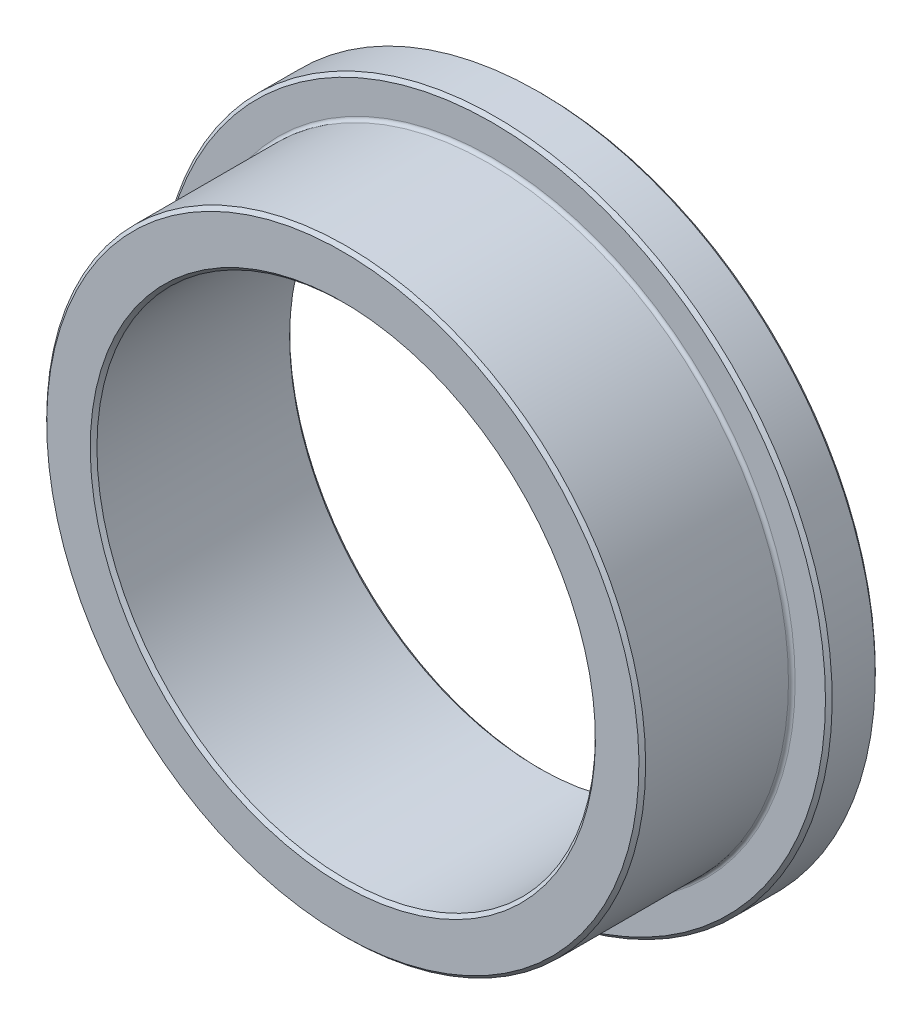
ISO-10303-21;
HEADER;
FILE_DESCRIPTION(('STEP AP214'),'2;1');
FILE_NAME('part.step','',(''),(''),'','','');
FILE_SCHEMA(('AUTOMOTIVE_DESIGN { 1 0 10303 214 1 1 1 1 }'));
ENDSEC;
DATA;
#1=APPLICATION_CONTEXT('core data for automotive mechanical design processes');
#2=APPLICATION_PROTOCOL_DEFINITION('international standard','automotive_design',2000,#1);
#3=PRODUCT_CONTEXT('',#1,'mechanical');
#4=PRODUCT('Part','Part','',(#3));
#5=PRODUCT_RELATED_PRODUCT_CATEGORY('part','',(#4));
#6=PRODUCT_DEFINITION_FORMATION('','',#4);
#7=PRODUCT_DEFINITION_CONTEXT('part definition',#1,'design');
#8=PRODUCT_DEFINITION('design','',#6,#7);
#9=PRODUCT_DEFINITION_SHAPE('','',#8);
#10=(LENGTH_UNIT() NAMED_UNIT(*) SI_UNIT(.MILLI.,.METRE.));
#11=(NAMED_UNIT(*) PLANE_ANGLE_UNIT() SI_UNIT($,.RADIAN.));
#12=(NAMED_UNIT(*) SI_UNIT($,.STERADIAN.) SOLID_ANGLE_UNIT());
#13=UNCERTAINTY_MEASURE_WITH_UNIT(LENGTH_MEASURE(1.E-05),#10,'distance_accuracy_value','');
#14=(GEOMETRIC_REPRESENTATION_CONTEXT(3) GLOBAL_UNCERTAINTY_ASSIGNED_CONTEXT((#13)) GLOBAL_UNIT_ASSIGNED_CONTEXT((#10,
#11,#12)) REPRESENTATION_CONTEXT('',''));
#15=CARTESIAN_POINT('',(0.,0.,0.));
#16=DIRECTION('',(0.,0.,1.));
#17=DIRECTION('',(1.,0.,0.));
#18=AXIS2_PLACEMENT_3D('',#15,#16,#17);
#19=CARTESIAN_POINT('',(0.,-19.0754,-3.175));
#20=DIRECTION('',(0.,0.,1.));
#21=DIRECTION('',(0.,-1.,0.));
#22=AXIS2_PLACEMENT_3D('',#19,#20,#21);
#23=PLANE('',#22);
#24=CARTESIAN_POINT('',(0.,0.,-3.175));
#25=DIRECTION('',(0.,0.,1.));
#26=DIRECTION('',(0.,-1.,0.));
#27=AXIS2_PLACEMENT_3D('',#24,#25,#26);
#28=CIRCLE('',#27,19.28876);
#29=CARTESIAN_POINT('',(0.,-19.28876,-3.175));
#30=VERTEX_POINT('',#29);
#31=EDGE_CURVE('E12',#30,#30,#28,.F.);
#32=ORIENTED_EDGE('',*,*,#31,.T.);
#33=EDGE_LOOP('',(#32));
#34=FACE_BOUND('',#33,.T.);
#35=CARTESIAN_POINT('',(0.,0.,-3.175));
#36=DIRECTION('',(0.,0.,1.));
#37=DIRECTION('',(0.,-1.,0.));
#38=AXIS2_PLACEMENT_3D('',#35,#36,#37);
#39=CIRCLE('',#38,21.21789);
#40=CARTESIAN_POINT('',(0.,-21.21789,-3.175));
#41=VERTEX_POINT('',#40);
#42=EDGE_CURVE('E62',#41,#41,#39,.T.);
#43=ORIENTED_EDGE('',*,*,#42,.T.);
#44=EDGE_LOOP('',(#43));
#45=FACE_BOUND('',#44,.T.);
#46=ADVANCED_FACE('F44',(#34,#45),#23,.T.);
#47=CARTESIAN_POINT('',(0.,0.,6.35));
#48=DIRECTION('',(0.,0.,1.));
#49=DIRECTION('',(0.,-1.,0.));
#50=AXIS2_PLACEMENT_3D('',#47,#48,#49);
#51=CYLINDRICAL_SURFACE('',#50,21.43125);
#52=CARTESIAN_POINT('',(0.,0.,-6.13664));
#53=DIRECTION('',(0.,0.,-1.));
#54=DIRECTION('',(0.,1.,0.));
#55=AXIS2_PLACEMENT_3D('',#52,#53,#54);
#56=CIRCLE('',#55,21.43125);
#57=CARTESIAN_POINT('',(0.,21.43125,-6.13663999999999));
#58=VERTEX_POINT('',#57);
#59=EDGE_CURVE('E71',#58,#58,#56,.F.);
#60=ORIENTED_EDGE('',*,*,#59,.T.);
#61=EDGE_LOOP('',(#60));
#62=FACE_BOUND('',#61,.T.);
#63=CARTESIAN_POINT('',(0.,0.,-3.38836));
#64=DIRECTION('',(0.,0.,1.));
#65=DIRECTION('',(0.,-1.,0.));
#66=AXIS2_PLACEMENT_3D('',#63,#64,#65);
#67=CIRCLE('',#66,21.43125);
#68=CARTESIAN_POINT('',(0.,-21.43125,-3.38836));
#69=VERTEX_POINT('',#68);
#70=EDGE_CURVE('E74',#69,#69,#67,.F.);
#71=ORIENTED_EDGE('',*,*,#70,.T.);
#72=EDGE_LOOP('',(#71));
#73=FACE_BOUND('',#72,.T.);
#74=ADVANCED_FACE('F114',(#62,#73),#51,.T.);
#75=CARTESIAN_POINT('',(0.,-21.43125,-6.35));
#76=DIRECTION('',(0.,0.,-1.));
#77=DIRECTION('',(0.,1.,0.));
#78=AXIS2_PLACEMENT_3D('',#75,#76,#77);
#79=PLANE('',#78);
#80=CARTESIAN_POINT('',(0.,0.,-6.35));
#81=DIRECTION('',(0.,0.,-1.));
#82=DIRECTION('',(0.,1.,0.));
#83=AXIS2_PLACEMENT_3D('',#80,#81,#82);
#84=CIRCLE('',#83,16.08836);
#85=CARTESIAN_POINT('',(0.,16.08836,-6.34999999999999));
#86=VERTEX_POINT('',#85);
#87=EDGE_CURVE('E91',#86,#86,#84,.F.);
#88=ORIENTED_EDGE('',*,*,#87,.T.);
#89=EDGE_LOOP('',(#88));
#90=FACE_BOUND('',#89,.T.);
#91=CARTESIAN_POINT('',(0.,0.,-6.35));
#92=DIRECTION('',(0.,0.,-1.));
#93=DIRECTION('',(0.,1.,0.));
#94=AXIS2_PLACEMENT_3D('',#91,#92,#93);
#95=CIRCLE('',#94,21.21789);
#96=CARTESIAN_POINT('',(0.,21.21789,-6.34999999999999));
#97=VERTEX_POINT('',#96);
#98=EDGE_CURVE('E100',#97,#97,#95,.T.);
#99=ORIENTED_EDGE('',*,*,#98,.T.);
#100=EDGE_LOOP('',(#99));
#101=FACE_BOUND('',#100,.T.);
#102=ADVANCED_FACE('F102',(#90,#101),#79,.T.);
#103=CARTESIAN_POINT('',(0.,0.,6.35));
#104=DIRECTION('',(0.,0.,1.));
#105=DIRECTION('',(0.,-1.,0.));
#106=AXIS2_PLACEMENT_3D('',#103,#104,#105);
#107=CYLINDRICAL_SURFACE('',#106,15.875);
#108=CARTESIAN_POINT('',(0.,0.,-6.13664));
#109=DIRECTION('',(0.,0.,-1.));
#110=DIRECTION('',(0.,1.,0.));
#111=AXIS2_PLACEMENT_3D('',#108,#109,#110);
#112=CIRCLE('',#111,15.875);
#113=CARTESIAN_POINT('',(0.,15.875,-6.13663999999999));
#114=VERTEX_POINT('',#113);
#115=EDGE_CURVE('E89',#114,#114,#112,.T.);
#116=ORIENTED_EDGE('',*,*,#115,.T.);
#117=EDGE_LOOP('',(#116));
#118=FACE_BOUND('',#117,.T.);
#119=CARTESIAN_POINT('',(0.,0.,6.13664));
#120=DIRECTION('',(0.,0.,1.));
#121=DIRECTION('',(0.,-1.,0.));
#122=AXIS2_PLACEMENT_3D('',#119,#120,#121);
#123=CIRCLE('',#122,15.875);
#124=CARTESIAN_POINT('',(0.,-15.875,6.13664));
#125=VERTEX_POINT('',#124);
#126=EDGE_CURVE('E92',#125,#125,#123,.T.);
#127=ORIENTED_EDGE('',*,*,#126,.T.);
#128=EDGE_LOOP('',(#127));
#129=FACE_BOUND('',#128,.T.);
#130=ADVANCED_FACE('F154',(#118,#129),#107,.F.);
#131=CARTESIAN_POINT('',(0.,-15.875,6.35));
#132=DIRECTION('',(0.,0.,1.));
#133=DIRECTION('',(0.,-1.,0.));
#134=AXIS2_PLACEMENT_3D('',#131,#132,#133);
#135=PLANE('',#134);
#136=CARTESIAN_POINT('',(0.,0.,6.35));
#137=DIRECTION('',(0.,0.,1.));
#138=DIRECTION('',(0.,-1.,0.));
#139=AXIS2_PLACEMENT_3D('',#136,#137,#138);
#140=CIRCLE('',#139,16.08836);
#141=CARTESIAN_POINT('',(0.,-16.08836,6.35));
#142=VERTEX_POINT('',#141);
#143=EDGE_CURVE('E79',#142,#142,#140,.F.);
#144=ORIENTED_EDGE('',*,*,#143,.T.);
#145=EDGE_LOOP('',(#144));
#146=FACE_BOUND('',#145,.T.);
#147=CARTESIAN_POINT('',(0.,0.,6.35));
#148=DIRECTION('',(0.,0.,1.));
#149=DIRECTION('',(0.,-1.,0.));
#150=AXIS2_PLACEMENT_3D('',#147,#148,#149);
#151=CIRCLE('',#150,18.86204);
#152=CARTESIAN_POINT('',(0.,-18.86204,6.35));
#153=VERTEX_POINT('',#152);
#154=EDGE_CURVE('E85',#153,#153,#151,.T.);
#155=ORIENTED_EDGE('',*,*,#154,.T.);
#156=EDGE_LOOP('',(#155));
#157=FACE_BOUND('',#156,.T.);
#158=ADVANCED_FACE('F147',(#146,#157),#135,.T.);
#159=CARTESIAN_POINT('',(0.,0.,6.35));
#160=DIRECTION('',(0.,0.,1.));
#161=DIRECTION('',(0.,-1.,0.));
#162=AXIS2_PLACEMENT_3D('',#159,#160,#161);
#163=CYLINDRICAL_SURFACE('',#162,19.0754);
#164=CARTESIAN_POINT('',(0.,0.,-2.96164));
#165=DIRECTION('',(0.,0.,1.));
#166=DIRECTION('',(0.,-1.,0.));
#167=AXIS2_PLACEMENT_3D('',#164,#165,#166);
#168=CIRCLE('',#167,19.0754);
#169=CARTESIAN_POINT('',(0.,-19.0754,-2.96164));
#170=VERTEX_POINT('',#169);
#171=EDGE_CURVE('E52',#170,#170,#168,.T.);
#172=ORIENTED_EDGE('',*,*,#171,.T.);
#173=EDGE_LOOP('',(#172));
#174=FACE_BOUND('',#173,.T.);
#175=CARTESIAN_POINT('',(0.,0.,6.13664));
#176=DIRECTION('',(0.,0.,1.));
#177=DIRECTION('',(0.,-1.,0.));
#178=AXIS2_PLACEMENT_3D('',#175,#176,#177);
#179=CIRCLE('',#178,19.0754);
#180=CARTESIAN_POINT('',(0.,-19.0754,6.13664));
#181=VERTEX_POINT('',#180);
#182=EDGE_CURVE('E56',#181,#181,#179,.F.);
#183=ORIENTED_EDGE('',*,*,#182,.T.);
#184=EDGE_LOOP('',(#183));
#185=FACE_BOUND('',#184,.T.);
#186=ADVANCED_FACE('F136',(#174,#185),#163,.T.);
#187=CARTESIAN_POINT('',(0.,0.,-6.35));
#188=DIRECTION('',(0.,0.,-1.));
#189=DIRECTION('',(0.,1.,0.));
#190=AXIS2_PLACEMENT_3D('',#187,#188,#189);
#191=CONICAL_SURFACE('',#190,16.08836,0.785398163397444);
#192=ORIENTED_EDGE('',*,*,#115,.F.);
#193=EDGE_LOOP('',(#192));
#194=FACE_BOUND('',#193,.T.);
#195=ORIENTED_EDGE('',*,*,#87,.F.);
#196=EDGE_LOOP('',(#195));
#197=FACE_BOUND('',#196,.T.);
#198=ADVANCED_FACE('F131',(#194,#197),#191,.F.);
#199=CARTESIAN_POINT('',(0.,0.,6.13664));
#200=DIRECTION('',(0.,0.,1.));
#201=DIRECTION('',(0.,-1.,0.));
#202=AXIS2_PLACEMENT_3D('',#199,#200,#201);
#203=CONICAL_SURFACE('',#202,15.875,0.785398163397446);
#204=ORIENTED_EDGE('',*,*,#143,.F.);
#205=EDGE_LOOP('',(#204));
#206=FACE_BOUND('',#205,.T.);
#207=ORIENTED_EDGE('',*,*,#126,.F.);
#208=EDGE_LOOP('',(#207));
#209=FACE_BOUND('',#208,.T.);
#210=ADVANCED_FACE('F111',(#206,#209),#203,.F.);
#211=CARTESIAN_POINT('',(0.,0.,-6.13664));
#212=DIRECTION('',(0.,0.,1.));
#213=DIRECTION('',(0.,-1.,0.));
#214=AXIS2_PLACEMENT_3D('',#211,#212,#213);
#215=CONICAL_SURFACE('',#214,21.43125,0.785398163397444);
#216=ORIENTED_EDGE('',*,*,#98,.F.);
#217=EDGE_LOOP('',(#216));
#218=FACE_BOUND('',#217,.T.);
#219=ORIENTED_EDGE('',*,*,#59,.F.);
#220=EDGE_LOOP('',(#219));
#221=FACE_BOUND('',#220,.T.);
#222=ADVANCED_FACE('F110',(#218,#221),#215,.T.);
#223=CARTESIAN_POINT('',(0.,0.,-3.175));
#224=DIRECTION('',(0.,0.,-1.));
#225=DIRECTION('',(0.,1.,0.));
#226=AXIS2_PLACEMENT_3D('',#223,#224,#225);
#227=CONICAL_SURFACE('',#226,21.21789,0.785398163397444);
#228=ORIENTED_EDGE('',*,*,#70,.F.);
#229=EDGE_LOOP('',(#228));
#230=FACE_BOUND('',#229,.T.);
#231=ORIENTED_EDGE('',*,*,#42,.F.);
#232=EDGE_LOOP('',(#231));
#233=FACE_BOUND('',#232,.T.);
#234=ADVANCED_FACE('F109',(#230,#233),#227,.T.);
#235=CARTESIAN_POINT('',(0.,0.,6.35));
#236=DIRECTION('',(0.,0.,-1.));
#237=DIRECTION('',(0.,1.,0.));
#238=AXIS2_PLACEMENT_3D('',#235,#236,#237);
#239=CONICAL_SURFACE('',#238,18.86204,0.785398163397446);
#240=ORIENTED_EDGE('',*,*,#182,.F.);
#241=EDGE_LOOP('',(#240));
#242=FACE_BOUND('',#241,.T.);
#243=ORIENTED_EDGE('',*,*,#154,.F.);
#244=EDGE_LOOP('',(#243));
#245=FACE_BOUND('',#244,.T.);
#246=ADVANCED_FACE('F124',(#242,#245),#239,.T.);
#247=CARTESIAN_POINT('',(0.,0.,-2.96164));
#248=DIRECTION('',(0.,0.,1.));
#249=DIRECTION('',(0.,-1.,0.));
#250=AXIS2_PLACEMENT_3D('',#247,#248,#249);
#251=TOROIDAL_SURFACE('',#250,19.28876,0.21336);
#252=ORIENTED_EDGE('',*,*,#31,.F.);
#253=EDGE_LOOP('',(#252));
#254=FACE_BOUND('',#253,.T.);
#255=ORIENTED_EDGE('',*,*,#171,.F.);
#256=EDGE_LOOP('',(#255));
#257=FACE_BOUND('',#256,.T.);
#258=ADVANCED_FACE('F50',(#254,#257),#251,.F.);
#259=CLOSED_SHELL('',(#46,#74,#102,#130,#158,#186,#198,#210,#222,#234,#246,#258));
#260=MANIFOLD_SOLID_BREP('B2',#259);
#261=ADVANCED_BREP_SHAPE_REPRESENTATION('',(#18,#260),#14);
#262=SHAPE_DEFINITION_REPRESENTATION(#9,#261);
ENDSEC;
END-ISO-10303-21;
